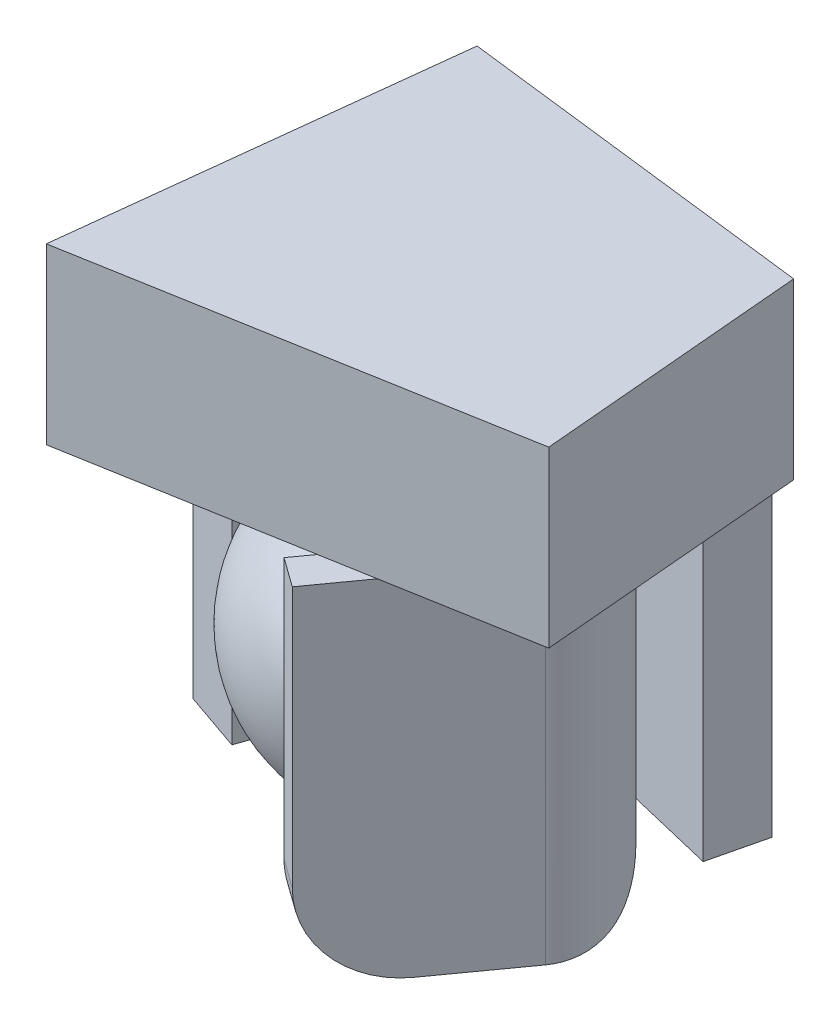
ISO-10303-21;
HEADER;
FILE_DESCRIPTION(('STEP AP214'),'2;1');
FILE_NAME('part.step','',(''),(''),'','','');
FILE_SCHEMA(('AUTOMOTIVE_DESIGN { 1 0 10303 214 1 1 1 1 }'));
ENDSEC;
DATA;
#1=APPLICATION_CONTEXT('core data for automotive mechanical design processes');
#2=APPLICATION_PROTOCOL_DEFINITION('international standard','automotive_design',2000,#1);
#3=PRODUCT_CONTEXT('',#1,'mechanical');
#4=PRODUCT('Part','Part','',(#3));
#5=PRODUCT_RELATED_PRODUCT_CATEGORY('part','',(#4));
#6=PRODUCT_DEFINITION_FORMATION('','',#4);
#7=PRODUCT_DEFINITION_CONTEXT('part definition',#1,'design');
#8=PRODUCT_DEFINITION('design','',#6,#7);
#9=PRODUCT_DEFINITION_SHAPE('','',#8);
#10=(LENGTH_UNIT() NAMED_UNIT(*) SI_UNIT(.MILLI.,.METRE.));
#11=(NAMED_UNIT(*) PLANE_ANGLE_UNIT() SI_UNIT($,.RADIAN.));
#12=(NAMED_UNIT(*) SI_UNIT($,.STERADIAN.) SOLID_ANGLE_UNIT());
#13=UNCERTAINTY_MEASURE_WITH_UNIT(LENGTH_MEASURE(1.E-05),#10,'distance_accuracy_value','');
#14=(GEOMETRIC_REPRESENTATION_CONTEXT(3) GLOBAL_UNCERTAINTY_ASSIGNED_CONTEXT((#13)) GLOBAL_UNIT_ASSIGNED_CONTEXT((#10,
#11,#12)) REPRESENTATION_CONTEXT('',''));
#15=CARTESIAN_POINT('',(0.,0.,0.));
#16=DIRECTION('',(0.,0.,1.));
#17=DIRECTION('',(1.,0.,0.));
#18=AXIS2_PLACEMENT_3D('',#15,#16,#17);
#19=CARTESIAN_POINT('',(0.,100.,0.));
#20=DIRECTION('',(0.,-1.,0.));
#21=DIRECTION('',(0.,0.,-1.));
#22=AXIS2_PLACEMENT_3D('',#19,#20,#21);
#23=PLANE('',#22);
#24=DIRECTION('',(0.583917331728651,0.,-0.811813124867351));
#25=VECTOR('',#24,1.);
#26=CARTESIAN_POINT('',(44.8662208079627,100.,118.606382058539));
#27=LINE('',#26,#25);
#28=CARTESIAN_POINT('',(65.3264272169362,100.,90.1608073208835));
#29=VERTEX_POINT('',#28);
#30=CARTESIAN_POINT('',(105.731442866905,100.,33.9862082247938));
#31=VERTEX_POINT('',#30);
#32=EDGE_CURVE('E192',#29,#31,#27,.T.);
#33=ORIENTED_EDGE('',*,*,#32,.T.);
#34=CARTESIAN_POINT('',(65.1407866235373,100.,4.79034163836128));
#35=DIRECTION('',(0.,-1.,0.));
#36=DIRECTION('',(0.,0.,-1.));
#37=AXIS2_PLACEMENT_3D('',#34,#35,#36);
#38=CIRCLE('',#37,50.);
#39=CARTESIAN_POINT('',(112.547664007642,100.,-11.1026749629161));
#40=VERTEX_POINT('',#39);
#41=EDGE_CURVE('E11',#31,#40,#38,.F.);
#42=ORIENTED_EDGE('',*,*,#41,.T.);
#43=DIRECTION('',(-0.58391733172865,0.,0.811813124867351));
#44=VECTOR('',#43,1.);
#45=CARTESIAN_POINT('',(112.547664007642,100.,-11.1026749629161));
#46=LINE('',#45,#44);
#47=CARTESIAN_POINT('',(36.0020503018042,100.,95.3177556029341));
#48=VERTEX_POINT('',#47);
#49=EDGE_CURVE('E201',#40,#48,#46,.T.);
#50=ORIENTED_EDGE('',*,*,#49,.T.);
#51=DIRECTION('',(0.984886513375252,0.,-0.173200911578257));
#52=VECTOR('',#51,1.);
#53=CARTESIAN_POINT('',(-96.4259715957366,100.,118.606382058539));
#54=LINE('',#53,#52);
#55=CARTESIAN_POINT('',(-96.4259715957366,100.,118.606382058539));
#56=VERTEX_POINT('',#55);
#57=EDGE_CURVE('E243',#56,#48,#54,.T.);
#58=ORIENTED_EDGE('',*,*,#57,.F.);
#59=DIRECTION('',(-0.113184294849486,0.,0.993574011032608));
#60=VECTOR('',#59,1.);
#61=CARTESIAN_POINT('',(-71.1192338079553,100.,-103.545613528775));
#62=LINE('',#61,#60);
#63=CARTESIAN_POINT('',(-80.0318230898535,100.,-25.3075762350168));
#64=VERTEX_POINT('',#63);
#65=EDGE_CURVE('E256',#64,#56,#62,.T.);
#66=ORIENTED_EDGE('',*,*,#65,.F.);
#67=DIRECTION('',(-0.326987146431735,0.,0.945028785841168));
#68=VECTOR('',#67,1.);
#69=CARTESIAN_POINT('',(-66.1597754639518,100.,-65.3993182747109));
#70=LINE('',#69,#68);
#71=CARTESIAN_POINT('',(-66.1597754639518,100.,-65.3993182747109));
#72=VERTEX_POINT('',#71);
#73=EDGE_CURVE('E290',#72,#64,#70,.T.);
#74=ORIENTED_EDGE('',*,*,#73,.F.);
#75=DIRECTION('',(0.916468450699753,0.,0.400106959289631));
#76=VECTOR('',#75,1.);
#77=CARTESIAN_POINT('',(-99.5419058993762,100.,-79.9731125967407));
#78=LINE('',#77,#76);
#79=CARTESIAN_POINT('',(-75.0238809484349,100.,-69.2691626643472));
#80=VERTEX_POINT('',#79);
#81=EDGE_CURVE('E285',#80,#72,#78,.T.);
#82=ORIENTED_EDGE('',*,*,#81,.F.);
#83=CARTESIAN_POINT('',(-71.1192338079553,100.,-103.545613528775));
#84=VERTEX_POINT('',#83);
#85=EDGE_CURVE('E258',#84,#80,#62,.T.);
#86=ORIENTED_EDGE('',*,*,#85,.F.);
#87=DIRECTION('',(-0.992819835019039,0.,-0.119619292728091));
#88=VECTOR('',#87,1.);
#89=CARTESIAN_POINT('',(135.665562560563,100.,-78.6312733675013));
#90=LINE('',#89,#88);
#91=CARTESIAN_POINT('',(-33.2907035000189,100.,-98.9878661099885));
#92=VERTEX_POINT('',#91);
#93=EDGE_CURVE('E252',#92,#84,#90,.T.);
#94=ORIENTED_EDGE('',*,*,#93,.F.);
#95=DIRECTION('',(-0.107330929927039,0.,0.994223350903104));
#96=VECTOR('',#95,1.);
#97=CARTESIAN_POINT('',(-30.8745618831775,100.,-121.368967402836));
#98=LINE('',#97,#96);
#99=CARTESIAN_POINT('',(-33.7642992022926,100.,-94.6008743415586));
#100=VERTEX_POINT('',#99);
#101=EDGE_CURVE('E234',#92,#100,#98,.T.);
#102=ORIENTED_EDGE('',*,*,#101,.T.);
#103=DIRECTION('',(0.972507959964089,0.,0.232869636935529));
#104=VECTOR('',#103,1.);
#105=CARTESIAN_POINT('',(-33.7642992022926,100.,-94.6008743415586));
#106=LINE('',#105,#104);
#107=CARTESIAN_POINT('',(99.619891790548,100.,-62.661672393444));
#108=VERTEX_POINT('',#107);
#109=EDGE_CURVE('E231',#100,#108,#106,.T.);
#110=ORIENTED_EDGE('',*,*,#109,.T.);
#111=DIRECTION('',(0.232869636935529,0.,-0.972507959964089));
#112=VECTOR('',#111,1.);
#113=CARTESIAN_POINT('',(99.619891790548,100.,-62.661672393444));
#114=LINE('',#113,#112);
#115=CARTESIAN_POINT('',(104.347394400845,100.,-82.4046237707323));
#116=VERTEX_POINT('',#115);
#117=EDGE_CURVE('E228',#108,#116,#114,.T.);
#118=ORIENTED_EDGE('',*,*,#117,.T.);
#119=CARTESIAN_POINT('',(135.665562560563,100.,-78.6312733675013));
#120=VERTEX_POINT('',#119);
#121=EDGE_CURVE('E253',#120,#116,#90,.T.);
#122=ORIENTED_EDGE('',*,*,#121,.F.);
#123=DIRECTION('',(-0.0865447393233193,0.,-0.996247965165028));
#124=VECTOR('',#123,1.);
#125=CARTESIAN_POINT('',(149.049609091202,100.,75.4373531726898));
#126=LINE('',#125,#124);
#127=CARTESIAN_POINT('',(149.049609091202,100.,75.4373531726898));
#128=VERTEX_POINT('',#127);
#129=EDGE_CURVE('E227',#128,#120,#126,.T.);
#130=ORIENTED_EDGE('',*,*,#129,.F.);
#131=EDGE_CURVE('E261',#29,#128,#54,.T.);
#132=ORIENTED_EDGE('',*,*,#131,.F.);
#133=EDGE_LOOP('',(#33,#42,#50,#58,#66,#74,#82,#86,#94,#102,#110,#118,#122,#130,#132));
#134=FACE_BOUND('',#133,.T.);
#135=ADVANCED_FACE('F38',(#134),#23,.T.);
#136=CARTESIAN_POINT('',(0.,100.,0.));
#137=DIRECTION('',(0.,-1.,0.));
#138=DIRECTION('',(0.,0.,-1.));
#139=AXIS2_PLACEMENT_3D('',#136,#137,#138);
#140=PLANE('',#139);
#141=EDGE_CURVE('E262',#80,#64,#62,.T.);
#142=ORIENTED_EDGE('',*,*,#141,.F.);
#143=CARTESIAN_POINT('',(-99.5419058993762,100.,-79.9731125967407));
#144=VERTEX_POINT('',#143);
#145=EDGE_CURVE('E286',#144,#80,#78,.T.);
#146=ORIENTED_EDGE('',*,*,#145,.F.);
#147=DIRECTION('',(0.326987146431735,0.,-0.945028785841168));
#148=VECTOR('',#147,1.);
#149=CARTESIAN_POINT('',(-128.156791582234,100.,2.72705151965056));
#150=LINE('',#149,#148);
#151=CARTESIAN_POINT('',(-128.156791582234,100.,2.72705151965056));
#152=VERTEX_POINT('',#151);
#153=EDGE_CURVE('E281',#152,#144,#150,.T.);
#154=ORIENTED_EDGE('',*,*,#153,.F.);
#155=DIRECTION('',(-0.945028785841168,0.,-0.326987146431735));
#156=VECTOR('',#155,1.);
#157=CARTESIAN_POINT('',(-93.8404171523178,100.,14.6007780334238));
#158=LINE('',#157,#156);
#159=CARTESIAN_POINT('',(-93.8404171523178,100.,14.6007780334238));
#160=VERTEX_POINT('',#159);
#161=EDGE_CURVE('E278',#160,#152,#158,.T.);
#162=ORIENTED_EDGE('',*,*,#161,.F.);
#163=EDGE_CURVE('E289',#64,#160,#70,.T.);
#164=ORIENTED_EDGE('',*,*,#163,.F.);
#165=EDGE_LOOP('',(#142,#146,#154,#162,#164));
#166=FACE_BOUND('',#165,.T.);
#167=ADVANCED_FACE('F347',(#166),#140,.F.);
#168=CARTESIAN_POINT('',(0.,0.,0.));
#169=DIRECTION('',(0.,1.,0.));
#170=DIRECTION('',(1.,0.,0.));
#171=AXIS2_PLACEMENT_3D('',#168,#169,#170);
#172=SPHERICAL_SURFACE('',#171,83.9986667522362);
#173=CARTESIAN_POINT('',(0.,0.,0.));
#174=DIRECTION('',(0.945028785841168,0.,0.326987146431735));
#175=DIRECTION('',(0.326987146431735,0.,-0.945028785841168));
#176=AXIS2_PLACEMENT_3D('',#173,#174,#175);
#177=SPHERICAL_SURFACE('',#176,83.9986667522362);
#178=CARTESIAN_POINT('',(-79.295124510455,0.,-27.4367160853665));
#179=DIRECTION('',(0.945028785841168,0.,0.326987146431735));
#180=DIRECTION('',(0.326987146431735,0.,-0.945028785841168));
#181=AXIS2_PLACEMENT_3D('',#178,#179,#180);
#182=CIRCLE('',#181,3.90971296589074);
#183=CARTESIAN_POINT('',(-78.0166986243712,0.,-31.1315073825097));
#184=VERTEX_POINT('',#183);
#185=EDGE_CURVE('E305',#184,#184,#182,.F.);
#186=ORIENTED_EDGE('',*,*,#185,.F.);
#187=EDGE_LOOP('',(#186));
#188=FACE_BOUND('',#187,.T.);
#189=ADVANCED_FACE('F353',(#188),#177,.T.);
#190=CARTESIAN_POINT('',(-93.8404171523178,100.,14.6007780334238));
#191=DIRECTION('',(-0.326987146431735,0.,0.945028785841168));
#192=DIRECTION('',(0.945028785841168,0.,0.326987146431735));
#193=AXIS2_PLACEMENT_3D('',#190,#191,#192);
#194=PLANE('',#193);
#195=DIRECTION('',(-0.945028785841168,0.,-0.326987146431735));
#196=VECTOR('',#195,1.);
#197=CARTESIAN_POINT('',(-93.8404171523178,-100.,14.6007780334238));
#198=LINE('',#197,#196);
#199=CARTESIAN_POINT('',(-93.8404171523178,-100.,14.6007780334238));
#200=VERTEX_POINT('',#199);
#201=CARTESIAN_POINT('',(-128.156791582234,-100.,2.72705151965056));
#202=VERTEX_POINT('',#201);
#203=EDGE_CURVE('E277',#200,#202,#198,.T.);
#204=ORIENTED_EDGE('',*,*,#203,.F.);
#205=DIRECTION('',(0.,-1.,0.));
#206=VECTOR('',#205,1.);
#207=CARTESIAN_POINT('',(-93.8404171523178,100.,14.6007780334238));
#208=LINE('',#207,#206);
#209=EDGE_CURVE('E303',#160,#200,#208,.T.);
#210=ORIENTED_EDGE('',*,*,#209,.F.);
#211=ORIENTED_EDGE('',*,*,#161,.T.);
#212=DIRECTION('',(0.,-1.,0.));
#213=VECTOR('',#212,1.);
#214=CARTESIAN_POINT('',(-128.156791582234,100.,2.72705151965056));
#215=LINE('',#214,#213);
#216=EDGE_CURVE('E292',#152,#202,#215,.T.);
#217=ORIENTED_EDGE('',*,*,#216,.T.);
#218=EDGE_LOOP('',(#204,#210,#211,#217));
#219=FACE_BOUND('',#218,.T.);
#220=ADVANCED_FACE('F385',(#219),#194,.T.);
#221=CARTESIAN_POINT('',(-66.1597754639518,100.,-65.3993182747109));
#222=DIRECTION('',(0.945028785841168,0.,0.326987146431735));
#223=DIRECTION('',(0.326987146431735,0.,-0.945028785841168));
#224=AXIS2_PLACEMENT_3D('',#221,#222,#223);
#225=PLANE('',#224);
#226=ORIENTED_EDGE('',*,*,#185,.T.);
#227=EDGE_LOOP('',(#226));
#228=FACE_BOUND('',#227,.T.);
#229=DIRECTION('',(-0.326987146431735,0.,0.945028785841168));
#230=VECTOR('',#229,1.);
#231=CARTESIAN_POINT('',(-66.1597754639518,-100.,-65.3993182747109));
#232=LINE('',#231,#230);
#233=CARTESIAN_POINT('',(-66.1597754639518,-100.,-65.3993182747109));
#234=VERTEX_POINT('',#233);
#235=EDGE_CURVE('E282',#234,#200,#232,.T.);
#236=ORIENTED_EDGE('',*,*,#235,.F.);
#237=DIRECTION('',(0.,-1.,0.));
#238=VECTOR('',#237,1.);
#239=CARTESIAN_POINT('',(-66.1597754639518,100.,-65.3993182747109));
#240=LINE('',#239,#238);
#241=EDGE_CURVE('E306',#72,#234,#240,.T.);
#242=ORIENTED_EDGE('',*,*,#241,.F.);
#243=ORIENTED_EDGE('',*,*,#73,.T.);
#244=ORIENTED_EDGE('',*,*,#163,.T.);
#245=ORIENTED_EDGE('',*,*,#209,.T.);
#246=EDGE_LOOP('',(#236,#242,#243,#244,#245));
#247=FACE_BOUND('',#246,.T.);
#248=ADVANCED_FACE('F381',(#228,#247),#225,.T.);
#249=CARTESIAN_POINT('',(-99.5419058993762,100.,-79.9731125967407));
#250=DIRECTION('',(0.400106959289631,0.,-0.916468450699753));
#251=DIRECTION('',(-0.916468450699753,0.,-0.400106959289631));
#252=AXIS2_PLACEMENT_3D('',#249,#250,#251);
#253=PLANE('',#252);
#254=DIRECTION('',(0.916468450699753,0.,0.400106959289631));
#255=VECTOR('',#254,1.);
#256=CARTESIAN_POINT('',(-99.5419058993762,-100.,-79.9731125967407));
#257=LINE('',#256,#255);
#258=CARTESIAN_POINT('',(-99.5419058993762,-100.,-79.9731125967407));
#259=VERTEX_POINT('',#258);
#260=EDGE_CURVE('E298',#259,#234,#257,.T.);
#261=ORIENTED_EDGE('',*,*,#260,.F.);
#262=DIRECTION('',(0.,-1.,0.));
#263=VECTOR('',#262,1.);
#264=CARTESIAN_POINT('',(-99.5419058993762,100.,-79.9731125967407));
#265=LINE('',#264,#263);
#266=EDGE_CURVE('E308',#144,#259,#265,.T.);
#267=ORIENTED_EDGE('',*,*,#266,.F.);
#268=ORIENTED_EDGE('',*,*,#145,.T.);
#269=ORIENTED_EDGE('',*,*,#81,.T.);
#270=ORIENTED_EDGE('',*,*,#241,.T.);
#271=EDGE_LOOP('',(#261,#267,#268,#269,#270));
#272=FACE_BOUND('',#271,.T.);
#273=ADVANCED_FACE('F384',(#272),#253,.T.);
#274=CARTESIAN_POINT('',(-128.156791582234,100.,2.72705151965056));
#275=DIRECTION('',(-0.945028785841168,0.,-0.326987146431735));
#276=DIRECTION('',(-0.326987146431735,0.,0.945028785841168));
#277=AXIS2_PLACEMENT_3D('',#274,#275,#276);
#278=PLANE('',#277);
#279=DIRECTION('',(0.326987146431735,0.,-0.945028785841168));
#280=VECTOR('',#279,1.);
#281=CARTESIAN_POINT('',(-128.156791582234,-100.,2.72705151965056));
#282=LINE('',#281,#280);
#283=EDGE_CURVE('E295',#202,#259,#282,.T.);
#284=ORIENTED_EDGE('',*,*,#283,.F.);
#285=ORIENTED_EDGE('',*,*,#216,.F.);
#286=ORIENTED_EDGE('',*,*,#153,.T.);
#287=ORIENTED_EDGE('',*,*,#266,.T.);
#288=EDGE_LOOP('',(#284,#285,#286,#287));
#289=FACE_BOUND('',#288,.T.);
#290=ADVANCED_FACE('F379',(#289),#278,.T.);
#291=CARTESIAN_POINT('',(0.,-100.,0.));
#292=DIRECTION('',(0.,-1.,0.));
#293=DIRECTION('',(0.,0.,-1.));
#294=AXIS2_PLACEMENT_3D('',#291,#292,#293);
#295=PLANE('',#294);
#296=ORIENTED_EDGE('',*,*,#203,.T.);
#297=ORIENTED_EDGE('',*,*,#283,.T.);
#298=ORIENTED_EDGE('',*,*,#260,.T.);
#299=ORIENTED_EDGE('',*,*,#235,.T.);
#300=EDGE_LOOP('',(#296,#297,#298,#299));
#301=FACE_BOUND('',#300,.T.);
#302=ADVANCED_FACE('F374',(#301),#295,.T.);
#303=CARTESIAN_POINT('',(149.049609091202,200.,75.4373531726898));
#304=DIRECTION('',(-0.996247965165028,0.,0.0865447393233193));
#305=DIRECTION('',(0.0865447393233193,0.,0.996247965165028));
#306=AXIS2_PLACEMENT_3D('',#303,#304,#305);
#307=PLANE('',#306);
#308=ORIENTED_EDGE('',*,*,#129,.T.);
#309=DIRECTION('',(0.,-1.,0.));
#310=VECTOR('',#309,1.);
#311=CARTESIAN_POINT('',(135.665562560563,200.,-78.6312733675013));
#312=LINE('',#311,#310);
#313=CARTESIAN_POINT('',(135.665562560563,200.,-78.6312733675013));
#314=VERTEX_POINT('',#313);
#315=EDGE_CURVE('E274',#314,#120,#312,.T.);
#316=ORIENTED_EDGE('',*,*,#315,.F.);
#317=DIRECTION('',(-0.0865447393233193,0.,-0.996247965165028));
#318=VECTOR('',#317,1.);
#319=CARTESIAN_POINT('',(149.049609091202,200.,75.4373531726898));
#320=LINE('',#319,#318);
#321=CARTESIAN_POINT('',(149.049609091202,200.,75.4373531726898));
#322=VERTEX_POINT('',#321);
#323=EDGE_CURVE('E239',#322,#314,#320,.T.);
#324=ORIENTED_EDGE('',*,*,#323,.F.);
#325=DIRECTION('',(0.,-1.,0.));
#326=VECTOR('',#325,1.);
#327=CARTESIAN_POINT('',(149.049609091202,200.,75.4373531726898));
#328=LINE('',#327,#326);
#329=EDGE_CURVE('E249',#322,#128,#328,.T.);
#330=ORIENTED_EDGE('',*,*,#329,.T.);
#331=EDGE_LOOP('',(#308,#316,#324,#330));
#332=FACE_BOUND('',#331,.T.);
#333=ADVANCED_FACE('F371',(#332),#307,.F.);
#334=CARTESIAN_POINT('',(135.665562560563,200.,-78.6312733675013));
#335=DIRECTION('',(-0.119619292728091,0.,0.992819835019039));
#336=DIRECTION('',(0.992819835019039,0.,0.119619292728091));
#337=AXIS2_PLACEMENT_3D('',#334,#335,#336);
#338=PLANE('',#337);
#339=ORIENTED_EDGE('',*,*,#121,.T.);
#340=EDGE_CURVE('E257',#116,#92,#90,.T.);
#341=ORIENTED_EDGE('',*,*,#340,.T.);
#342=ORIENTED_EDGE('',*,*,#93,.T.);
#343=DIRECTION('',(0.,-1.,0.));
#344=VECTOR('',#343,1.);
#345=CARTESIAN_POINT('',(-71.1192338079553,200.,-103.545613528775));
#346=LINE('',#345,#344);
#347=CARTESIAN_POINT('',(-71.1192338079553,200.,-103.545613528775));
#348=VERTEX_POINT('',#347);
#349=EDGE_CURVE('E271',#348,#84,#346,.T.);
#350=ORIENTED_EDGE('',*,*,#349,.F.);
#351=DIRECTION('',(-0.992819835019039,0.,-0.119619292728091));
#352=VECTOR('',#351,1.);
#353=CARTESIAN_POINT('',(135.665562560563,200.,-78.6312733675013));
#354=LINE('',#353,#352);
#355=EDGE_CURVE('E242',#314,#348,#354,.T.);
#356=ORIENTED_EDGE('',*,*,#355,.F.);
#357=ORIENTED_EDGE('',*,*,#315,.T.);
#358=EDGE_LOOP('',(#339,#341,#342,#350,#356,#357));
#359=FACE_BOUND('',#358,.T.);
#360=ADVANCED_FACE('F367',(#359),#338,.F.);
#361=CARTESIAN_POINT('',(-71.1192338079553,200.,-103.545613528775));
#362=DIRECTION('',(0.993574011032608,0.,0.113184294849486));
#363=DIRECTION('',(0.113184294849486,0.,-0.993574011032608));
#364=AXIS2_PLACEMENT_3D('',#361,#362,#363);
#365=PLANE('',#364);
#366=ORIENTED_EDGE('',*,*,#85,.T.);
#367=ORIENTED_EDGE('',*,*,#141,.T.);
#368=ORIENTED_EDGE('',*,*,#65,.T.);
#369=DIRECTION('',(0.,-1.,0.));
#370=VECTOR('',#369,1.);
#371=CARTESIAN_POINT('',(-96.4259715957366,200.,118.606382058539));
#372=LINE('',#371,#370);
#373=CARTESIAN_POINT('',(-96.4259715957366,200.,118.606382058539));
#374=VERTEX_POINT('',#373);
#375=EDGE_CURVE('E268',#374,#56,#372,.T.);
#376=ORIENTED_EDGE('',*,*,#375,.F.);
#377=DIRECTION('',(-0.113184294849486,0.,0.993574011032608));
#378=VECTOR('',#377,1.);
#379=CARTESIAN_POINT('',(-71.1192338079553,200.,-103.545613528775));
#380=LINE('',#379,#378);
#381=EDGE_CURVE('E245',#348,#374,#380,.T.);
#382=ORIENTED_EDGE('',*,*,#381,.F.);
#383=ORIENTED_EDGE('',*,*,#349,.T.);
#384=EDGE_LOOP('',(#366,#367,#368,#376,#382,#383));
#385=FACE_BOUND('',#384,.T.);
#386=ADVANCED_FACE('F363',(#385),#365,.F.);
#387=CARTESIAN_POINT('',(-96.4259715957366,200.,118.606382058539));
#388=DIRECTION('',(-0.173200911578257,0.,-0.984886513375252));
#389=DIRECTION('',(-0.984886513375252,0.,0.173200911578257));
#390=AXIS2_PLACEMENT_3D('',#387,#388,#389);
#391=PLANE('',#390);
#392=ORIENTED_EDGE('',*,*,#57,.T.);
#393=EDGE_CURVE('E265',#48,#29,#54,.T.);
#394=ORIENTED_EDGE('',*,*,#393,.T.);
#395=ORIENTED_EDGE('',*,*,#131,.T.);
#396=ORIENTED_EDGE('',*,*,#329,.F.);
#397=DIRECTION('',(0.984886513375252,0.,-0.173200911578257));
#398=VECTOR('',#397,1.);
#399=CARTESIAN_POINT('',(-96.4259715957366,200.,118.606382058539));
#400=LINE('',#399,#398);
#401=EDGE_CURVE('E247',#374,#322,#400,.T.);
#402=ORIENTED_EDGE('',*,*,#401,.F.);
#403=ORIENTED_EDGE('',*,*,#375,.T.);
#404=EDGE_LOOP('',(#392,#394,#395,#396,#402,#403));
#405=FACE_BOUND('',#404,.T.);
#406=ADVANCED_FACE('F360',(#405),#391,.F.);
#407=CARTESIAN_POINT('',(0.,200.,0.));
#408=DIRECTION('',(0.,-1.,0.));
#409=DIRECTION('',(0.,0.,-1.));
#410=AXIS2_PLACEMENT_3D('',#407,#408,#409);
#411=PLANE('',#410);
#412=ORIENTED_EDGE('',*,*,#323,.T.);
#413=ORIENTED_EDGE('',*,*,#355,.T.);
#414=ORIENTED_EDGE('',*,*,#381,.T.);
#415=ORIENTED_EDGE('',*,*,#401,.T.);
#416=EDGE_LOOP('',(#412,#413,#414,#415));
#417=FACE_BOUND('',#416,.T.);
#418=ADVANCED_FACE('F358',(#417),#411,.F.);
#419=CARTESIAN_POINT('',(0.,100.,0.));
#420=DIRECTION('',(0.,-1.,0.));
#421=DIRECTION('',(0.,0.,-1.));
#422=AXIS2_PLACEMENT_3D('',#419,#420,#421);
#423=PLANE('',#422);
#424=CARTESIAN_POINT('',(-30.8745618831775,100.,-121.368967402836));
#425=VERTEX_POINT('',#424);
#426=EDGE_CURVE('E235',#425,#92,#98,.T.);
#427=ORIENTED_EDGE('',*,*,#426,.T.);
#428=ORIENTED_EDGE('',*,*,#340,.F.);
#429=CARTESIAN_POINT('',(107.267819280975,100.,-94.6008743415586));
#430=VERTEX_POINT('',#429);
#431=EDGE_CURVE('E216',#116,#430,#114,.T.);
#432=ORIENTED_EDGE('',*,*,#431,.T.);
#433=DIRECTION('',(-0.981738915469294,0.,-0.190233282716707));
#434=VECTOR('',#433,1.);
#435=CARTESIAN_POINT('',(107.267819280975,100.,-94.6008743415586));
#436=LINE('',#435,#434);
#437=EDGE_CURVE('E220',#430,#425,#436,.T.);
#438=ORIENTED_EDGE('',*,*,#437,.T.);
#439=EDGE_LOOP('',(#427,#428,#432,#438));
#440=FACE_BOUND('',#439,.T.);
#441=ADVANCED_FACE('F454',(#440),#423,.F.);
#442=CARTESIAN_POINT('',(107.267819280975,100.,-94.6008743415586));
#443=DIRECTION('',(-0.190233282716707,0.,0.981738915469294));
#444=DIRECTION('',(0.981738915469294,0.,0.190233282716707));
#445=AXIS2_PLACEMENT_3D('',#442,#443,#444);
#446=PLANE('',#445);
#447=DIRECTION('',(-0.981738915469294,0.,-0.190233282716707));
#448=VECTOR('',#447,1.);
#449=CARTESIAN_POINT('',(107.267819280975,-100.,-94.6008743415586));
#450=LINE('',#449,#448);
#451=CARTESIAN_POINT('',(107.267819280975,-100.,-94.6008743415586));
#452=VERTEX_POINT('',#451);
#453=CARTESIAN_POINT('',(-30.8745618831775,-100.,-121.368967402836));
#454=VERTEX_POINT('',#453);
#455=EDGE_CURVE('E224',#452,#454,#450,.T.);
#456=ORIENTED_EDGE('',*,*,#455,.T.);
#457=DIRECTION('',(0.,-1.,0.));
#458=VECTOR('',#457,1.);
#459=CARTESIAN_POINT('',(-30.8745618831775,100.,-121.368967402836));
#460=LINE('',#459,#458);
#461=EDGE_CURVE('E204',#425,#454,#460,.T.);
#462=ORIENTED_EDGE('',*,*,#461,.F.);
#463=ORIENTED_EDGE('',*,*,#437,.F.);
#464=DIRECTION('',(0.,-1.,0.));
#465=VECTOR('',#464,1.);
#466=CARTESIAN_POINT('',(107.267819280975,100.,-94.6008743415586));
#467=LINE('',#466,#465);
#468=EDGE_CURVE('E213',#430,#452,#467,.T.);
#469=ORIENTED_EDGE('',*,*,#468,.T.);
#470=EDGE_LOOP('',(#456,#462,#463,#469));
#471=FACE_BOUND('',#470,.T.);
#472=ADVANCED_FACE('F458',(#471),#446,.F.);
#473=CARTESIAN_POINT('',(-30.8745618831775,100.,-121.368967402836));
#474=DIRECTION('',(0.994223350903104,0.,0.107330929927039));
#475=DIRECTION('',(0.107330929927039,0.,-0.994223350903104));
#476=AXIS2_PLACEMENT_3D('',#473,#474,#475);
#477=PLANE('',#476);
#478=DIRECTION('',(-0.107330929927039,0.,0.994223350903104));
#479=VECTOR('',#478,1.);
#480=CARTESIAN_POINT('',(-30.8745618831775,-100.,-121.368967402836));
#481=LINE('',#480,#479);
#482=CARTESIAN_POINT('',(-33.7642992022926,-100.,-94.6008743415586));
#483=VERTEX_POINT('',#482);
#484=EDGE_CURVE('E222',#454,#483,#481,.T.);
#485=ORIENTED_EDGE('',*,*,#484,.T.);
#486=DIRECTION('',(0.,-1.,0.));
#487=VECTOR('',#486,1.);
#488=CARTESIAN_POINT('',(-33.7642992022926,100.,-94.6008743415586));
#489=LINE('',#488,#487);
#490=EDGE_CURVE('E207',#100,#483,#489,.T.);
#491=ORIENTED_EDGE('',*,*,#490,.F.);
#492=ORIENTED_EDGE('',*,*,#101,.F.);
#493=ORIENTED_EDGE('',*,*,#426,.F.);
#494=ORIENTED_EDGE('',*,*,#461,.T.);
#495=EDGE_LOOP('',(#485,#491,#492,#493,#494));
#496=FACE_BOUND('',#495,.T.);
#497=ADVANCED_FACE('F426',(#496),#477,.F.);
#498=CARTESIAN_POINT('',(-33.7642992022926,100.,-94.6008743415586));
#499=DIRECTION('',(0.232869636935529,0.,-0.97250795996409));
#500=DIRECTION('',(-0.97250795996409,0.,-0.232869636935529));
#501=AXIS2_PLACEMENT_3D('',#498,#499,#500);
#502=PLANE('',#501);
#503=DIRECTION('',(0.972507959964089,0.,0.232869636935529));
#504=VECTOR('',#503,1.);
#505=CARTESIAN_POINT('',(-33.7642992022926,-100.,-94.6008743415586));
#506=LINE('',#505,#504);
#507=CARTESIAN_POINT('',(99.619891790548,-100.,-62.661672393444));
#508=VERTEX_POINT('',#507);
#509=EDGE_CURVE('E219',#483,#508,#506,.T.);
#510=ORIENTED_EDGE('',*,*,#509,.T.);
#511=DIRECTION('',(0.,-1.,0.));
#512=VECTOR('',#511,1.);
#513=CARTESIAN_POINT('',(99.619891790548,100.,-62.661672393444));
#514=LINE('',#513,#512);
#515=EDGE_CURVE('E210',#108,#508,#514,.T.);
#516=ORIENTED_EDGE('',*,*,#515,.F.);
#517=ORIENTED_EDGE('',*,*,#109,.F.);
#518=ORIENTED_EDGE('',*,*,#490,.T.);
#519=EDGE_LOOP('',(#510,#516,#517,#518));
#520=FACE_BOUND('',#519,.T.);
#521=ADVANCED_FACE('F429',(#520),#502,.F.);
#522=CARTESIAN_POINT('',(99.619891790548,100.,-62.661672393444));
#523=DIRECTION('',(-0.972507959964089,0.,-0.232869636935529));
#524=DIRECTION('',(-0.232869636935529,0.,0.97250795996409));
#525=AXIS2_PLACEMENT_3D('',#522,#523,#524);
#526=PLANE('',#525);
#527=DIRECTION('',(0.232869636935529,0.,-0.972507959964089));
#528=VECTOR('',#527,1.);
#529=CARTESIAN_POINT('',(99.619891790548,-100.,-62.661672393444));
#530=LINE('',#529,#528);
#531=EDGE_CURVE('E217',#508,#452,#530,.T.);
#532=ORIENTED_EDGE('',*,*,#531,.T.);
#533=ORIENTED_EDGE('',*,*,#468,.F.);
#534=ORIENTED_EDGE('',*,*,#431,.F.);
#535=ORIENTED_EDGE('',*,*,#117,.F.);
#536=ORIENTED_EDGE('',*,*,#515,.T.);
#537=EDGE_LOOP('',(#532,#533,#534,#535,#536));
#538=FACE_BOUND('',#537,.T.);
#539=ADVANCED_FACE('F434',(#538),#526,.F.);
#540=CARTESIAN_POINT('',(0.,-100.,0.));
#541=DIRECTION('',(0.,-1.,0.));
#542=DIRECTION('',(0.,0.,-1.));
#543=AXIS2_PLACEMENT_3D('',#540,#541,#542);
#544=PLANE('',#543);
#545=ORIENTED_EDGE('',*,*,#455,.F.);
#546=ORIENTED_EDGE('',*,*,#531,.F.);
#547=ORIENTED_EDGE('',*,*,#509,.F.);
#548=ORIENTED_EDGE('',*,*,#484,.F.);
#549=EDGE_LOOP('',(#545,#546,#547,#548));
#550=FACE_BOUND('',#549,.T.);
#551=ADVANCED_FACE('F466',(#550),#544,.T.);
#552=CARTESIAN_POINT('',(0.,100.,0.));
#553=DIRECTION('',(0.,1.,0.));
#554=DIRECTION('',(0.,0.,1.));
#555=AXIS2_PLACEMENT_3D('',#552,#553,#554);
#556=PLANE('',#555);
#557=ORIENTED_EDGE('',*,*,#393,.F.);
#558=CARTESIAN_POINT('',(27.9848245640623,100.,106.464006493715));
#559=VERTEX_POINT('',#558);
#560=EDGE_CURVE('E181',#48,#559,#46,.T.);
#561=ORIENTED_EDGE('',*,*,#560,.T.);
#562=DIRECTION('',(0.811813124867351,0.,0.583917331728651));
#563=VECTOR('',#562,1.);
#564=CARTESIAN_POINT('',(27.9848245640623,100.,106.464006493715));
#565=LINE('',#564,#563);
#566=CARTESIAN_POINT('',(44.8662208079627,100.,118.606382058539));
#567=VERTEX_POINT('',#566);
#568=EDGE_CURVE('E175',#559,#567,#565,.T.);
#569=ORIENTED_EDGE('',*,*,#568,.T.);
#570=EDGE_CURVE('E179',#567,#29,#27,.T.);
#571=ORIENTED_EDGE('',*,*,#570,.T.);
#572=EDGE_LOOP('',(#557,#561,#569,#571));
#573=FACE_BOUND('',#572,.T.);
#574=ADVANCED_FACE('F177',(#573),#556,.T.);
#575=CARTESIAN_POINT('',(112.547664007642,100.,-11.1026749629161));
#576=DIRECTION('',(0.811813124867351,0.,0.58391733172865));
#577=DIRECTION('',(0.58391733172865,0.,-0.811813124867351));
#578=AXIS2_PLACEMENT_3D('',#575,#576,#577);
#579=PLANE('',#578);
#580=DIRECTION('',(-0.58391733172865,0.,0.811813124867351));
#581=VECTOR('',#580,1.);
#582=CARTESIAN_POINT('',(112.547664007642,-59.4161431816348,-11.1026749629161));
#583=LINE('',#582,#581);
#584=CARTESIAN_POINT('',(112.547664007642,-59.4161431816348,-11.102674962916));
#585=VERTEX_POINT('',#584);
#586=CARTESIAN_POINT('',(28.5072211573509,-59.4161431816348,105.737724899089));
#587=VERTEX_POINT('',#586);
#588=EDGE_CURVE('E316',#585,#587,#583,.T.);
#589=ORIENTED_EDGE('',*,*,#588,.T.);
#590=CARTESIAN_POINT('',(57.1806911504948,-50.,65.8733502503479));
#591=DIRECTION('',(0.811813124867351,0.,0.58391733172865));
#592=DIRECTION('',(0.58391733172865,0.,-0.811813124867351));
#593=AXIS2_PLACEMENT_3D('',#590,#591,#592);
#594=CIRCLE('',#593,50.);
#595=CARTESIAN_POINT('',(27.9848245640623,-50.,106.464006493715));
#596=VERTEX_POINT('',#595);
#597=EDGE_CURVE('E318',#587,#596,#594,.F.);
#598=ORIENTED_EDGE('',*,*,#597,.T.);
#599=DIRECTION('',(0.,-1.,0.));
#600=VECTOR('',#599,1.);
#601=CARTESIAN_POINT('',(27.9848245640623,100.,106.464006493715));
#602=LINE('',#601,#600);
#603=EDGE_CURVE('E193',#559,#596,#602,.T.);
#604=ORIENTED_EDGE('',*,*,#603,.F.);
#605=ORIENTED_EDGE('',*,*,#560,.F.);
#606=ORIENTED_EDGE('',*,*,#49,.F.);
#607=DIRECTION('',(0.,-1.,0.));
#608=VECTOR('',#607,1.);
#609=CARTESIAN_POINT('',(112.547664007642,100.,-11.1026749629161));
#610=LINE('',#609,#608);
#611=EDGE_CURVE('E328',#40,#585,#610,.T.);
#612=ORIENTED_EDGE('',*,*,#611,.T.);
#613=EDGE_LOOP('',(#589,#598,#604,#605,#606,#612));
#614=FACE_BOUND('',#613,.T.);
#615=ADVANCED_FACE('F445',(#614),#579,.F.);
#616=CARTESIAN_POINT('',(27.9848245640623,100.,106.464006493715));
#617=DIRECTION('',(0.583917331728651,0.,-0.811813124867351));
#618=DIRECTION('',(-0.811813124867351,0.,-0.583917331728651));
#619=AXIS2_PLACEMENT_3D('',#616,#617,#618);
#620=PLANE('',#619);
#621=ORIENTED_EDGE('',*,*,#603,.T.);
#622=DIRECTION('',(0.811813124867351,0.,0.583917331728651));
#623=VECTOR('',#622,1.);
#624=CARTESIAN_POINT('',(27.9848245640623,-50.,106.464006493715));
#625=LINE('',#624,#623);
#626=CARTESIAN_POINT('',(44.8662208079627,-50.,118.606382058539));
#627=VERTEX_POINT('',#626);
#628=EDGE_CURVE('E191',#596,#627,#625,.T.);
#629=ORIENTED_EDGE('',*,*,#628,.T.);
#630=DIRECTION('',(0.,-1.,0.));
#631=VECTOR('',#630,1.);
#632=CARTESIAN_POINT('',(44.8662208079627,100.,118.606382058539));
#633=LINE('',#632,#631);
#634=EDGE_CURVE('E188',#567,#627,#633,.T.);
#635=ORIENTED_EDGE('',*,*,#634,.F.);
#636=ORIENTED_EDGE('',*,*,#568,.F.);
#637=EDGE_LOOP('',(#621,#629,#635,#636));
#638=FACE_BOUND('',#637,.T.);
#639=ADVANCED_FACE('F189',(#638),#620,.F.);
#640=CARTESIAN_POINT('',(44.8662208079627,100.,118.606382058539));
#641=DIRECTION('',(-0.811813124867351,0.,-0.583917331728651));
#642=DIRECTION('',(-0.583917331728651,0.,0.811813124867351));
#643=AXIS2_PLACEMENT_3D('',#640,#641,#642);
#644=PLANE('',#643);
#645=DIRECTION('',(0.583917331728651,0.,-0.811813124867351));
#646=VECTOR('',#645,1.);
#647=CARTESIAN_POINT('',(44.8662208079627,-100.,118.606382058539));
#648=LINE('',#647,#646);
#649=CARTESIAN_POINT('',(74.0620873943952,-100.,78.0157258151715));
#650=VERTEX_POINT('',#649);
#651=CARTESIAN_POINT('',(105.731442866905,-100.,33.9862082247938));
#652=VERTEX_POINT('',#651);
#653=EDGE_CURVE('E199',#650,#652,#648,.T.);
#654=ORIENTED_EDGE('',*,*,#653,.T.);
#655=DIRECTION('',(0.,1.,0.));
#656=VECTOR('',#655,1.);
#657=CARTESIAN_POINT('',(105.731442866905,100.,33.9862082247938));
#658=LINE('',#657,#656);
#659=EDGE_CURVE('E47',#652,#31,#658,.T.);
#660=ORIENTED_EDGE('',*,*,#659,.T.);
#661=ORIENTED_EDGE('',*,*,#32,.F.);
#662=ORIENTED_EDGE('',*,*,#570,.F.);
#663=ORIENTED_EDGE('',*,*,#634,.T.);
#664=CARTESIAN_POINT('',(74.0620873943952,-50.,78.0157258151715));
#665=DIRECTION('',(-0.811813124867351,0.,-0.583917331728651));
#666=DIRECTION('',(-0.583917331728651,0.,0.811813124867351));
#667=AXIS2_PLACEMENT_3D('',#664,#665,#666);
#668=CIRCLE('',#667,50.);
#669=EDGE_CURVE('E314',#627,#650,#668,.F.);
#670=ORIENTED_EDGE('',*,*,#669,.T.);
#671=EDGE_LOOP('',(#654,#660,#661,#662,#663,#670));
#672=FACE_BOUND('',#671,.T.);
#673=ADVANCED_FACE('F195',(#672),#644,.F.);
#674=CARTESIAN_POINT('',(109.501110115372,-59.4161431816348,78.7614711825958));
#675=DIRECTION('',(-0.583917331728651,0.,0.811813124867351));
#676=DIRECTION('',(0.811813124867351,0.,0.583917331728651));
#677=AXIS2_PLACEMENT_3D('',#674,#675,#676);
#678=CYLINDRICAL_SURFACE('',#677,50.);
#679=ORIENTED_EDGE('',*,*,#588,.F.);
#680=CARTESIAN_POINT('',(112.547664007642,-59.4161431816348,-11.102674962916));
#681=CARTESIAN_POINT('',(112.547648895261,-59.9636412724418,-11.1026711466066));
#682=CARTESIAN_POINT('',(112.551185263593,-60.511135811483,-11.0921702074075));
#683=CARTESIAN_POINT('',(112.565250471095,-61.6052326904068,-11.0501485327696));
#684=CARTESIAN_POINT('',(112.575779376408,-62.151835021801,-11.0186275985029));
#685=CARTESIAN_POINT('',(112.603721339438,-63.243337001818,-10.9345338333714));
#686=CARTESIAN_POINT('',(112.621135469224,-63.7882363719565,-10.8819577240794));
#687=CARTESIAN_POINT('',(112.662617058054,-64.8752955616218,-10.755717892845));
#688=CARTESIAN_POINT('',(112.686684500017,-65.4174553881785,-10.6820542250441));
#689=CARTESIAN_POINT('',(112.768561254392,-67.0408369481223,-10.428967777784));
#690=CARTESIAN_POINT('',(112.83598795059,-68.1168054386833,-10.2176143687494));
#691=CARTESIAN_POINT('',(112.992918318526,-70.2465556342122,-9.70944968433353));
#692=CARTESIAN_POINT('',(113.082420817709,-71.3003385143411,-9.41264294765722));
#693=CARTESIAN_POINT('',(113.278699191584,-73.3802490056193,-8.73248655661681));
#694=CARTESIAN_POINT('',(113.385507299824,-74.4063207585842,-8.34897486756744));
#695=CARTESIAN_POINT('',(113.609810478526,-76.4208353180344,-7.49575470916287));
#696=CARTESIAN_POINT('',(113.727305695218,-77.4092776093794,-7.02604506028569));
#697=CARTESIAN_POINT('',(113.964961385493,-79.3392571271825,-6.00204712520257));
#698=CARTESIAN_POINT('',(114.085117855352,-80.2808587030429,-5.44787937608044));
#699=CARTESIAN_POINT('',(114.319231480739,-82.110944525903,-4.25668592782488));
#700=CARTESIAN_POINT('',(114.433188957118,-82.9994315222793,-3.61966452288555));
#701=CARTESIAN_POINT('',(114.641424877689,-84.6872336628833,-2.28950965205247));
#702=CARTESIAN_POINT('',(114.736237548217,-85.4885459827768,-1.59899444854001));
#703=CARTESIAN_POINT('',(114.901507095799,-87.0294517939009,-0.149541378900803));
#704=CARTESIAN_POINT('',(114.971964526878,-87.7690466887654,0.609394930313939));
#705=CARTESIAN_POINT('',(115.079315648183,-89.1821722065942,2.18854704567888));
#706=CARTESIAN_POINT('',(115.11621242366,-89.8557088972499,3.00875721138258));
#707=CARTESIAN_POINT('',(115.147873120358,-91.1340383166834,4.70183650371638));
#708=CARTESIAN_POINT('',(115.142638618289,-91.7388336171638,5.57470365851038));
#709=CARTESIAN_POINT('',(115.084374238128,-92.8442828758268,7.30930975921437));
#710=CARTESIAN_POINT('',(115.034241233615,-93.3490147426277,8.16855411094351));
#711=CARTESIAN_POINT('',(114.885093984503,-94.2972492096344,9.91603352916632));
#712=CARTESIAN_POINT('',(114.786081634668,-94.7407541823923,10.8042674706586));
#713=CARTESIAN_POINT('',(114.535264386904,-95.568157516524,12.601154823151));
#714=CARTESIAN_POINT('',(114.383440915868,-95.9520348386945,13.5098153126485));
#715=CARTESIAN_POINT('',(114.024357409025,-96.6622638719551,15.338559885573));
#716=CARTESIAN_POINT('',(113.817096346078,-96.9886145170137,16.2586441803572));
#717=CARTESIAN_POINT('',(113.339477289035,-97.5942954751086,18.1259684330841));
#718=CARTESIAN_POINT('',(113.067618360114,-97.8721820066337,19.0732922543374));
#719=CARTESIAN_POINT('',(112.4633648219,-98.3734028063035,20.9630950379129));
#720=CARTESIAN_POINT('',(112.130964842798,-98.596732231279,21.9055735628412));
#721=CARTESIAN_POINT('',(111.406146820808,-98.9917279610931,23.7778042777389));
#722=CARTESIAN_POINT('',(111.013748657238,-99.1634113222173,24.7075605722288));
#723=CARTESIAN_POINT('',(110.17018459799,-99.4577567553754,26.5475866463605));
#724=CARTESIAN_POINT('',(109.719034177512,-99.5804317016143,27.4578614841144));
#725=CARTESIAN_POINT('',(108.718905698586,-99.7872752554552,29.3294142701372));
#726=CARTESIAN_POINT('',(108.164875555446,-99.8672948566373,30.2884688297495));
#727=CARTESIAN_POINT('',(107.286689913772,-99.9470414425218,31.698127229045));
#728=CARTESIAN_POINT('',(106.986437473571,-99.9669100309397,32.1627299075356));
#729=CARTESIAN_POINT('',(106.370442876193,-99.9933843089361,33.0820652348339));
#730=CARTESIAN_POINT('',(106.054697789572,-99.9999874802306,33.5367959933687));
#731=CARTESIAN_POINT('',(105.731442866905,-100.,33.9862082247938));
#732=B_SPLINE_CURVE_WITH_KNOTS('',3,(#680,#681,#682,#683,#684,#685,#686,#687,#688,#689,#690,
#691,#692,#693,#694,#695,#696,#697,#698,#699,#700,#701,#702,#703,#704,#705,#706,#707,#708,#709,
#710,#711,#712,#713,#714,#715,#716,#717,#718,#719,#720,#721,#722,#723,#724,#725,#726,#727,#728,
#729,#730,#731),.UNSPECIFIED.,.F.,.F.,(4,2,2,2,2,2,2,2,2,2,2,2,2,2,2,2,2,2,2,2,2,2,2,2,2,4),(0.,
1.64237480071418,3.2847651368612,4.92741130332434,6.57005325240142,9.86180494899266,
13.1533818421599,16.4511616587537,19.7489866051147,23.0421482828519,26.3351393483892,
29.5170294087738,32.6988470839931,35.8803722231907,39.061778298295,42.0516228710601,
45.0413515543222,48.0321327579953,51.0229693782447,54.0915976545118,57.1604982415896,
60.2283841984829,63.2954637100885,66.6227095639501,68.2829220292413,69.9434496366183),.UNSPECIFIED.);
#733=EDGE_CURVE('E61',#585,#652,#732,.T.);
#734=ORIENTED_EDGE('',*,*,#733,.T.);
#735=ORIENTED_EDGE('',*,*,#653,.F.);
#736=CARTESIAN_POINT('',(74.0620873943952,-100.,78.0157258151715));
#737=CARTESIAN_POINT('',(73.7865783384696,-100.00001556346,78.3988473146538));
#738=CARTESIAN_POINT('',(73.5034642837387,-99.9933198154972,78.7764763270672));
#739=CARTESIAN_POINT('',(72.9229848143882,-99.9666235700008,79.520044806734));
#740=CARTESIAN_POINT('',(72.625621534736,-99.9466250598777,79.8859860115689));
#741=CARTESIAN_POINT('',(72.0181096739835,-99.8934927228927,80.6048906403105));
#742=CARTESIAN_POINT('',(71.7079870343876,-99.8603844716916,80.9578778794956));
#743=CARTESIAN_POINT('',(71.0755610166643,-99.7812578880565,81.6512345716151));
#744=CARTESIAN_POINT('',(70.7532572733087,-99.7352391682594,81.9916036456095));
#745=CARTESIAN_POINT('',(69.7784044749831,-99.5795726372675,82.9847558709092));
#746=CARTESIAN_POINT('',(69.109802319963,-99.4515933146487,83.6191141577747));
#747=CARTESIAN_POINT('',(67.739210198851,-99.1488651108096,84.8389139201925));
#748=CARTESIAN_POINT('',(67.0372013812412,-98.9740895586529,85.4243272497049));
#749=CARTESIAN_POINT('',(65.3232116696109,-98.5016469463988,86.7744219182805));
#750=CARTESIAN_POINT('',(64.2996587561706,-98.1827938078935,87.5170347701636));
#751=CARTESIAN_POINT('',(62.2272338250385,-97.4652201390425,88.9239367005236));
#752=CARTESIAN_POINT('',(61.1783513372723,-97.0664660665967,89.5881926984197));
#753=CARTESIAN_POINT('',(59.0657174121169,-96.1911594564177,90.8548211883868));
#754=CARTESIAN_POINT('',(58.0019137899043,-95.714126053072,91.4567711069957));
#755=CARTESIAN_POINT('',(55.8798670242249,-94.6873324282105,92.6050651492737));
#756=CARTESIAN_POINT('',(54.8216231684621,-94.1375817714639,93.1514165693251));
#757=CARTESIAN_POINT('',(52.663988228057,-92.9348843483844,94.2266169802586));
#758=CARTESIAN_POINT('',(51.5655329980973,-92.2779260617694,94.7528529299123));
#759=CARTESIAN_POINT('',(49.3986504600301,-90.8858808889748,95.762233495355));
#760=CARTESIAN_POINT('',(48.3302250857983,-90.150788985622,96.2453753402858));
#761=CARTESIAN_POINT('',(46.2362399155583,-88.6040480327443,97.1740024838261));
#762=CARTESIAN_POINT('',(45.2106105833033,-87.7925307561991,97.6195501751238));
#763=CARTESIAN_POINT('',(43.2114428997731,-86.091919028026,98.4783792251426));
#764=CARTESIAN_POINT('',(42.2379006208234,-85.2028304390757,98.8916630178361));
#765=CARTESIAN_POINT('',(40.4093479604362,-83.4012269439068,99.6658985129281));
#766=CARTESIAN_POINT('',(39.5507369032409,-82.4930807502225,100.028495842223));
#767=CARTESIAN_POINT('',(37.9005743041564,-80.6088229186529,100.729535802228));
#768=CARTESIAN_POINT('',(37.1090228481538,-79.6327111937235,101.067978402002));
#769=CARTESIAN_POINT('',(35.6061510128318,-77.6166811690385,101.720876589163));
#770=CARTESIAN_POINT('',(34.8946443925035,-76.5769200563449,102.035387282636));
#771=CARTESIAN_POINT('',(33.5617305008929,-74.4347058624822,102.641664719866));
#772=CARTESIAN_POINT('',(32.9403140000087,-73.3322592194883,102.933433792051));
#773=CARTESIAN_POINT('',(31.8718192371905,-71.2126001207186,103.45880413677));
#774=CARTESIAN_POINT('',(31.4126401020281,-70.2021491188874,103.695102544394));
#775=CARTESIAN_POINT('',(30.5806895450428,-68.1424581090337,104.15003898894));
#776=CARTESIAN_POINT('',(30.2078907405924,-67.0932305158468,104.368682608084));
#777=CARTESIAN_POINT('',(29.7177323003776,-65.4910361914433,104.684054535166));
#778=CARTESIAN_POINT('',(29.5653540788462,-64.9498830480359,104.787492271564));
#779=CARTESIAN_POINT('',(29.2852565072775,-63.8603544190993,104.98980148838));
#780=CARTESIAN_POINT('',(29.1575366014389,-63.3119790966566,105.088673071682));
#781=CARTESIAN_POINT('',(28.9274124437439,-62.2085118533344,105.281927981392));
#782=CARTESIAN_POINT('',(28.8250362246089,-61.6534132010667,105.376306245391));
#783=CARTESIAN_POINT('',(28.6463892062758,-60.5382177157795,105.560466299432));
#784=CARTESIAN_POINT('',(28.5701210882237,-59.9781203754812,105.650247616589));
#785=CARTESIAN_POINT('',(28.5072211573508,-59.4161431816348,105.737724899089));
#786=B_SPLINE_CURVE_WITH_KNOTS('',3,(#736,#737,#738,#739,#740,#741,#742,#743,#744,#745,#746,
#747,#748,#749,#750,#751,#752,#753,#754,#755,#756,#757,#758,#759,#760,#761,#762,#763,#764,#765,
#766,#767,#768,#769,#770,#771,#772,#773,#774,#775,#776,#777,#778,#779,#780,#781,#782,#783,#784,
#785),.UNSPECIFIED.,.F.,.F.,(4,2,2,2,2,2,2,2,2,2,2,2,2,2,2,2,2,2,2,2,2,2,2,2,4),(0.,
1.41552250658374,2.83083358397118,4.2433970426445,5.65600288811546,8.44374596859549,
11.233081283569,15.1392071064657,19.0469761541376,22.9797166730021,26.9119404174107,
31.0603196223552,35.208965367169,39.3505845799606,43.4918910485275,47.3923776716409,
51.2928692902343,55.1840892307386,59.0749102392685,62.4755177307706,65.8750457478991,
67.5894559937611,69.3038275921087,71.0200870728532,72.7365227503445),.UNSPECIFIED.);
#787=EDGE_CURVE('E320',#587,#650,#786,.F.);
#788=ORIENTED_EDGE('',*,*,#787,.F.);
#789=EDGE_LOOP('',(#679,#734,#735,#788));
#790=FACE_BOUND('',#789,.T.);
#791=ADVANCED_FACE('F333',(#790),#678,.T.);
#792=CARTESIAN_POINT('',(57.1806911504949,-50.,65.8733502503479));
#793=DIRECTION('',(0.811813124867351,0.,0.583917331728651));
#794=DIRECTION('',(0.583917331728651,0.,-0.811813124867351));
#795=AXIS2_PLACEMENT_3D('',#792,#793,#794);
#796=CYLINDRICAL_SURFACE('',#795,50.);
#797=ORIENTED_EDGE('',*,*,#597,.F.);
#798=ORIENTED_EDGE('',*,*,#787,.T.);
#799=ORIENTED_EDGE('',*,*,#669,.F.);
#800=ORIENTED_EDGE('',*,*,#628,.F.);
#801=EDGE_LOOP('',(#797,#798,#799,#800));
#802=FACE_BOUND('',#801,.T.);
#803=ADVANCED_FACE('F336',(#802),#796,.T.);
#804=CARTESIAN_POINT('',(65.1407866235373,100.,4.79034163836128));
#805=DIRECTION('',(0.,1.,0.));
#806=DIRECTION('',(0.,0.,1.));
#807=AXIS2_PLACEMENT_3D('',#804,#805,#806);
#808=CYLINDRICAL_SURFACE('',#807,50.);
#809=ORIENTED_EDGE('',*,*,#41,.F.);
#810=ORIENTED_EDGE('',*,*,#659,.F.);
#811=ORIENTED_EDGE('',*,*,#733,.F.);
#812=ORIENTED_EDGE('',*,*,#611,.F.);
#813=EDGE_LOOP('',(#809,#810,#811,#812));
#814=FACE_BOUND('',#813,.T.);
#815=ADVANCED_FACE('F40',(#814),#808,.T.);
#816=CLOSED_SHELL('',(#135,#167,#189,#220,#248,#273,#290,#302,#333,#360,#386,#406,#418,#441,
#472,#497,#521,#539,#551,#574,#615,#639,#673,#791,#803,#815));
#817=CARTESIAN_POINT('',(0.,0.,0.));
#818=DIRECTION('',(0.,1.,0.));
#819=DIRECTION('',(1.,0.,0.));
#820=AXIS2_PLACEMENT_3D('',#817,#818,#819);
#821=SPHERICAL_SURFACE('',#820,80.7875304719657);
#822=CARTESIAN_POINT('',(0.,80.7875304719657,0.));
#823=VERTEX_POINT('',#822);
#824=VERTEX_LOOP('',#823);
#825=FACE_BOUND('',#824,.T.);
#826=ADVANCED_FACE('F396',(#825),#821,.F.);
#827=CLOSED_SHELL('',(#826));
#828=ORIENTED_CLOSED_SHELL('',*,#827,.T.);
#829=BREP_WITH_VOIDS('B2',#816,(#828));
#830=ADVANCED_BREP_SHAPE_REPRESENTATION('',(#18,#829),#14);
#831=SHAPE_DEFINITION_REPRESENTATION(#9,#830);
ENDSEC;
END-ISO-10303-21;
